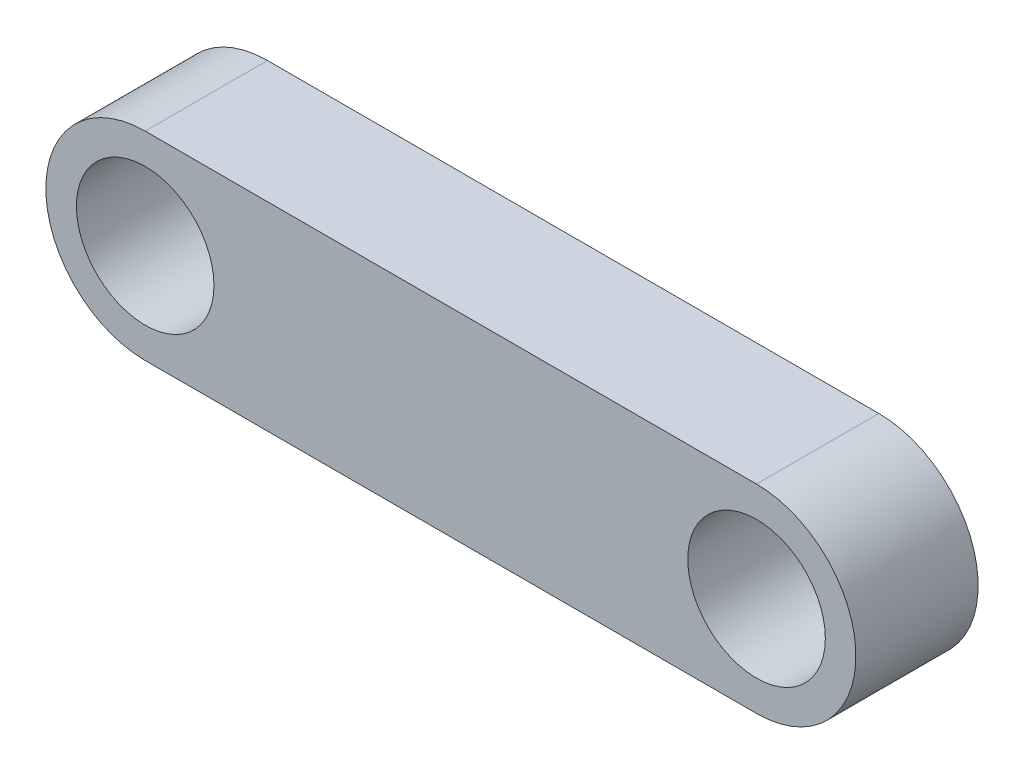
ISO-10303-21;
HEADER;
FILE_DESCRIPTION(('STEP AP214'),'2;1');
FILE_NAME('part.step','',(''),(''),'','','');
FILE_SCHEMA(('AUTOMOTIVE_DESIGN { 1 0 10303 214 1 1 1 1 }'));
ENDSEC;
DATA;
#1=APPLICATION_CONTEXT('core data for automotive mechanical design processes');
#2=APPLICATION_PROTOCOL_DEFINITION('international standard','automotive_design',2000,#1);
#3=PRODUCT_CONTEXT('',#1,'mechanical');
#4=PRODUCT('Part','Part','',(#3));
#5=PRODUCT_RELATED_PRODUCT_CATEGORY('part','',(#4));
#6=PRODUCT_DEFINITION_FORMATION('','',#4);
#7=PRODUCT_DEFINITION_CONTEXT('part definition',#1,'design');
#8=PRODUCT_DEFINITION('design','',#6,#7);
#9=PRODUCT_DEFINITION_SHAPE('','',#8);
#10=(LENGTH_UNIT() NAMED_UNIT(*) SI_UNIT(.MILLI.,.METRE.));
#11=(NAMED_UNIT(*) PLANE_ANGLE_UNIT() SI_UNIT($,.RADIAN.));
#12=(NAMED_UNIT(*) SI_UNIT($,.STERADIAN.) SOLID_ANGLE_UNIT());
#13=UNCERTAINTY_MEASURE_WITH_UNIT(LENGTH_MEASURE(1.E-05),#10,'distance_accuracy_value','');
#14=(GEOMETRIC_REPRESENTATION_CONTEXT(3) GLOBAL_UNCERTAINTY_ASSIGNED_CONTEXT((#13)) GLOBAL_UNIT_ASSIGNED_CONTEXT((#10,
#11,#12)) REPRESENTATION_CONTEXT('',''));
#15=CARTESIAN_POINT('',(0.,0.,0.));
#16=DIRECTION('',(0.,0.,1.));
#17=DIRECTION('',(1.,0.,0.));
#18=AXIS2_PLACEMENT_3D('',#15,#16,#17);
#19=CARTESIAN_POINT('',(0.,0.,2.));
#20=DIRECTION('',(0.,0.,1.));
#21=DIRECTION('',(1.,0.,0.));
#22=AXIS2_PLACEMENT_3D('',#19,#20,#21);
#23=PLANE('',#22);
#24=CARTESIAN_POINT('',(0.,0.,2.));
#25=DIRECTION('',(0.,0.,1.));
#26=DIRECTION('',(1.,0.,0.));
#27=AXIS2_PLACEMENT_3D('',#24,#25,#26);
#28=CIRCLE('',#27,2.25);
#29=CARTESIAN_POINT('',(2.25,0.,2.));
#30=VERTEX_POINT('',#29);
#31=EDGE_CURVE('E116',#30,#30,#28,.T.);
#32=ORIENTED_EDGE('',*,*,#31,.F.);
#33=EDGE_LOOP('',(#32));
#34=FACE_BOUND('',#33,.T.);
#35=CARTESIAN_POINT('',(0.,0.,2.));
#36=DIRECTION('',(0.,0.,1.));
#37=DIRECTION('',(1.,0.,0.));
#38=AXIS2_PLACEMENT_3D('',#35,#36,#37);
#39=CIRCLE('',#38,3.25);
#40=CARTESIAN_POINT('',(0.,3.25,2.));
#41=VERTEX_POINT('',#40);
#42=CARTESIAN_POINT('',(0.,-3.25,2.));
#43=VERTEX_POINT('',#42);
#44=EDGE_CURVE('E96',#41,#43,#39,.T.);
#45=ORIENTED_EDGE('',*,*,#44,.T.);
#46=DIRECTION('',(1.,0.,0.));
#47=VECTOR('',#46,1.);
#48=CARTESIAN_POINT('',(0.,-3.25,2.));
#49=LINE('',#48,#47);
#50=CARTESIAN_POINT('',(20.,-3.25,2.));
#51=VERTEX_POINT('',#50);
#52=EDGE_CURVE('E91',#43,#51,#49,.T.);
#53=ORIENTED_EDGE('',*,*,#52,.T.);
#54=CARTESIAN_POINT('',(20.,0.,2.));
#55=DIRECTION('',(0.,0.,1.));
#56=DIRECTION('',(1.,0.,0.));
#57=AXIS2_PLACEMENT_3D('',#54,#55,#56);
#58=CIRCLE('',#57,3.25);
#59=CARTESIAN_POINT('',(20.,3.25,2.));
#60=VERTEX_POINT('',#59);
#61=EDGE_CURVE('E94',#51,#60,#58,.T.);
#62=ORIENTED_EDGE('',*,*,#61,.T.);
#63=DIRECTION('',(-1.,0.,0.));
#64=VECTOR('',#63,1.);
#65=CARTESIAN_POINT('',(0.,3.25,2.));
#66=LINE('',#65,#64);
#67=EDGE_CURVE('E61',#60,#41,#66,.T.);
#68=ORIENTED_EDGE('',*,*,#67,.T.);
#69=EDGE_LOOP('',(#45,#53,#62,#68));
#70=FACE_BOUND('',#69,.T.);
#71=CARTESIAN_POINT('',(20.,0.,2.));
#72=DIRECTION('',(0.,0.,1.));
#73=DIRECTION('',(1.,0.,0.));
#74=AXIS2_PLACEMENT_3D('',#71,#72,#73);
#75=CIRCLE('',#74,2.25);
#76=CARTESIAN_POINT('',(22.25,0.,2.));
#77=VERTEX_POINT('',#76);
#78=EDGE_CURVE('E138',#77,#77,#75,.T.);
#79=ORIENTED_EDGE('',*,*,#78,.F.);
#80=EDGE_LOOP('',(#79));
#81=FACE_BOUND('',#80,.T.);
#82=ADVANCED_FACE('F43',(#34,#70,#81),#23,.T.);
#83=CARTESIAN_POINT('',(0.,0.,-2.));
#84=DIRECTION('',(0.,0.,1.));
#85=DIRECTION('',(1.,0.,0.));
#86=AXIS2_PLACEMENT_3D('',#83,#84,#85);
#87=PLANE('',#86);
#88=CARTESIAN_POINT('',(0.,0.,-2.));
#89=DIRECTION('',(0.,0.,1.));
#90=DIRECTION('',(1.,0.,0.));
#91=AXIS2_PLACEMENT_3D('',#88,#89,#90);
#92=CIRCLE('',#91,3.25);
#93=CARTESIAN_POINT('',(0.,3.25,-2.));
#94=VERTEX_POINT('',#93);
#95=CARTESIAN_POINT('',(0.,-3.25,-2.));
#96=VERTEX_POINT('',#95);
#97=EDGE_CURVE('E112',#94,#96,#92,.T.);
#98=ORIENTED_EDGE('',*,*,#97,.F.);
#99=DIRECTION('',(-1.,0.,0.));
#100=VECTOR('',#99,1.);
#101=CARTESIAN_POINT('',(0.,3.25,-2.));
#102=LINE('',#101,#100);
#103=CARTESIAN_POINT('',(20.,3.25,-2.));
#104=VERTEX_POINT('',#103);
#105=EDGE_CURVE('E84',#104,#94,#102,.T.);
#106=ORIENTED_EDGE('',*,*,#105,.F.);
#107=CARTESIAN_POINT('',(20.,0.,-2.));
#108=DIRECTION('',(0.,0.,1.));
#109=DIRECTION('',(1.,0.,0.));
#110=AXIS2_PLACEMENT_3D('',#107,#108,#109);
#111=CIRCLE('',#110,3.25);
#112=CARTESIAN_POINT('',(20.,-3.25,-2.));
#113=VERTEX_POINT('',#112);
#114=EDGE_CURVE('E78',#113,#104,#111,.T.);
#115=ORIENTED_EDGE('',*,*,#114,.F.);
#116=DIRECTION('',(1.,0.,0.));
#117=VECTOR('',#116,1.);
#118=CARTESIAN_POINT('',(0.,-3.25,-2.));
#119=LINE('',#118,#117);
#120=EDGE_CURVE('E101',#96,#113,#119,.T.);
#121=ORIENTED_EDGE('',*,*,#120,.F.);
#122=EDGE_LOOP('',(#98,#106,#115,#121));
#123=FACE_BOUND('',#122,.T.);
#124=CARTESIAN_POINT('',(0.,0.,-2.));
#125=DIRECTION('',(0.,0.,1.));
#126=DIRECTION('',(1.,0.,0.));
#127=AXIS2_PLACEMENT_3D('',#124,#125,#126);
#128=CIRCLE('',#127,2.25);
#129=CARTESIAN_POINT('',(2.25,0.,-2.));
#130=VERTEX_POINT('',#129);
#131=EDGE_CURVE('E134',#130,#130,#128,.T.);
#132=ORIENTED_EDGE('',*,*,#131,.T.);
#133=EDGE_LOOP('',(#132));
#134=FACE_BOUND('',#133,.T.);
#135=CARTESIAN_POINT('',(20.,0.,-2.));
#136=DIRECTION('',(0.,0.,1.));
#137=DIRECTION('',(1.,0.,0.));
#138=AXIS2_PLACEMENT_3D('',#135,#136,#137);
#139=CIRCLE('',#138,2.25);
#140=CARTESIAN_POINT('',(22.25,0.,-2.));
#141=VERTEX_POINT('',#140);
#142=EDGE_CURVE('E142',#141,#141,#139,.T.);
#143=ORIENTED_EDGE('',*,*,#142,.T.);
#144=EDGE_LOOP('',(#143));
#145=FACE_BOUND('',#144,.T.);
#146=ADVANCED_FACE('F129',(#123,#134,#145),#87,.F.);
#147=CARTESIAN_POINT('',(0.,0.,2.));
#148=DIRECTION('',(0.,0.,-1.));
#149=DIRECTION('',(-1.,0.,0.));
#150=AXIS2_PLACEMENT_3D('',#147,#148,#149);
#151=CYLINDRICAL_SURFACE('',#150,3.25);
#152=ORIENTED_EDGE('',*,*,#97,.T.);
#153=DIRECTION('',(0.,0.,-1.));
#154=VECTOR('',#153,1.);
#155=CARTESIAN_POINT('',(0.,-3.25,2.));
#156=LINE('',#155,#154);
#157=EDGE_CURVE('E11',#43,#96,#156,.T.);
#158=ORIENTED_EDGE('',*,*,#157,.F.);
#159=ORIENTED_EDGE('',*,*,#44,.F.);
#160=DIRECTION('',(0.,0.,-1.));
#161=VECTOR('',#160,1.);
#162=CARTESIAN_POINT('',(0.,3.25,2.));
#163=LINE('',#162,#161);
#164=EDGE_CURVE('E108',#41,#94,#163,.T.);
#165=ORIENTED_EDGE('',*,*,#164,.T.);
#166=EDGE_LOOP('',(#152,#158,#159,#165));
#167=FACE_BOUND('',#166,.T.);
#168=ADVANCED_FACE('F45',(#167),#151,.T.);
#169=CARTESIAN_POINT('',(0.,-3.25,2.));
#170=DIRECTION('',(0.,1.,0.));
#171=DIRECTION('',(0.,0.,1.));
#172=AXIS2_PLACEMENT_3D('',#169,#170,#171);
#173=PLANE('',#172);
#174=ORIENTED_EDGE('',*,*,#120,.T.);
#175=DIRECTION('',(0.,0.,-1.));
#176=VECTOR('',#175,1.);
#177=CARTESIAN_POINT('',(20.,-3.25,2.));
#178=LINE('',#177,#176);
#179=EDGE_CURVE('E53',#51,#113,#178,.T.);
#180=ORIENTED_EDGE('',*,*,#179,.F.);
#181=ORIENTED_EDGE('',*,*,#52,.F.);
#182=ORIENTED_EDGE('',*,*,#157,.T.);
#183=EDGE_LOOP('',(#174,#180,#181,#182));
#184=FACE_BOUND('',#183,.T.);
#185=ADVANCED_FACE('F100',(#184),#173,.F.);
#186=CARTESIAN_POINT('',(20.,0.,2.));
#187=DIRECTION('',(0.,0.,-1.));
#188=DIRECTION('',(-1.,0.,0.));
#189=AXIS2_PLACEMENT_3D('',#186,#187,#188);
#190=CYLINDRICAL_SURFACE('',#189,3.25);
#191=ORIENTED_EDGE('',*,*,#114,.T.);
#192=DIRECTION('',(0.,0.,-1.));
#193=VECTOR('',#192,1.);
#194=CARTESIAN_POINT('',(20.,3.25,2.));
#195=LINE('',#194,#193);
#196=EDGE_CURVE('E103',#60,#104,#195,.T.);
#197=ORIENTED_EDGE('',*,*,#196,.F.);
#198=ORIENTED_EDGE('',*,*,#61,.F.);
#199=ORIENTED_EDGE('',*,*,#179,.T.);
#200=EDGE_LOOP('',(#191,#197,#198,#199));
#201=FACE_BOUND('',#200,.T.);
#202=ADVANCED_FACE('F104',(#201),#190,.T.);
#203=CARTESIAN_POINT('',(0.,3.25,2.));
#204=DIRECTION('',(0.,-1.,0.));
#205=DIRECTION('',(0.,0.,-1.));
#206=AXIS2_PLACEMENT_3D('',#203,#204,#205);
#207=PLANE('',#206);
#208=ORIENTED_EDGE('',*,*,#105,.T.);
#209=ORIENTED_EDGE('',*,*,#164,.F.);
#210=ORIENTED_EDGE('',*,*,#67,.F.);
#211=ORIENTED_EDGE('',*,*,#196,.T.);
#212=EDGE_LOOP('',(#208,#209,#210,#211));
#213=FACE_BOUND('',#212,.T.);
#214=ADVANCED_FACE('F126',(#213),#207,.F.);
#215=CARTESIAN_POINT('',(0.,0.,2.));
#216=DIRECTION('',(0.,0.,-1.));
#217=DIRECTION('',(-1.,0.,0.));
#218=AXIS2_PLACEMENT_3D('',#215,#216,#217);
#219=CYLINDRICAL_SURFACE('',#218,2.25);
#220=ORIENTED_EDGE('',*,*,#31,.T.);
#221=EDGE_LOOP('',(#220));
#222=FACE_BOUND('',#221,.T.);
#223=ORIENTED_EDGE('',*,*,#131,.F.);
#224=EDGE_LOOP('',(#223));
#225=FACE_BOUND('',#224,.T.);
#226=ADVANCED_FACE('F161',(#222,#225),#219,.F.);
#227=CARTESIAN_POINT('',(20.,0.,2.));
#228=DIRECTION('',(0.,0.,-1.));
#229=DIRECTION('',(-1.,0.,0.));
#230=AXIS2_PLACEMENT_3D('',#227,#228,#229);
#231=CYLINDRICAL_SURFACE('',#230,2.25);
#232=ORIENTED_EDGE('',*,*,#78,.T.);
#233=EDGE_LOOP('',(#232));
#234=FACE_BOUND('',#233,.T.);
#235=ORIENTED_EDGE('',*,*,#142,.F.);
#236=EDGE_LOOP('',(#235));
#237=FACE_BOUND('',#236,.T.);
#238=ADVANCED_FACE('F150',(#234,#237),#231,.F.);
#239=CLOSED_SHELL('',(#82,#146,#168,#185,#202,#214,#226,#238));
#240=MANIFOLD_SOLID_BREP('B2',#239);
#241=ADVANCED_BREP_SHAPE_REPRESENTATION('',(#18,#240),#14);
#242=SHAPE_DEFINITION_REPRESENTATION(#9,#241);
ENDSEC;
END-ISO-10303-21;
